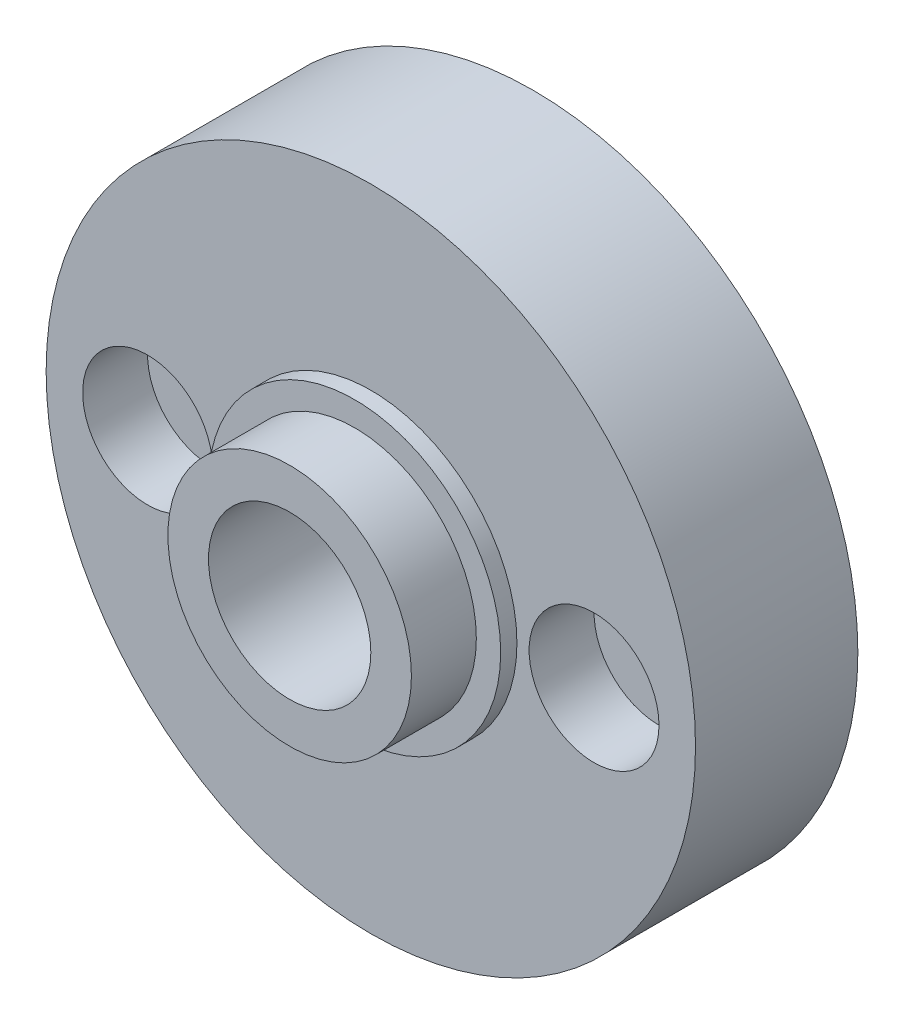
ISO-10303-21;
HEADER;
FILE_DESCRIPTION(('STEP AP214'),'2;1');
FILE_NAME('part.step','',(''),(''),'','','');
FILE_SCHEMA(('AUTOMOTIVE_DESIGN { 1 0 10303 214 1 1 1 1 }'));
ENDSEC;
DATA;
#1=APPLICATION_CONTEXT('core data for automotive mechanical design processes');
#2=APPLICATION_PROTOCOL_DEFINITION('international standard','automotive_design',2000,#1);
#3=PRODUCT_CONTEXT('',#1,'mechanical');
#4=PRODUCT('Part','Part','',(#3));
#5=PRODUCT_RELATED_PRODUCT_CATEGORY('part','',(#4));
#6=PRODUCT_DEFINITION_FORMATION('','',#4);
#7=PRODUCT_DEFINITION_CONTEXT('part definition',#1,'design');
#8=PRODUCT_DEFINITION('design','',#6,#7);
#9=PRODUCT_DEFINITION_SHAPE('','',#8);
#10=(LENGTH_UNIT() NAMED_UNIT(*) SI_UNIT(.MILLI.,.METRE.));
#11=(NAMED_UNIT(*) PLANE_ANGLE_UNIT() SI_UNIT($,.RADIAN.));
#12=(NAMED_UNIT(*) SI_UNIT($,.STERADIAN.) SOLID_ANGLE_UNIT());
#13=UNCERTAINTY_MEASURE_WITH_UNIT(LENGTH_MEASURE(1.E-05),#10,'distance_accuracy_value','');
#14=(GEOMETRIC_REPRESENTATION_CONTEXT(3) GLOBAL_UNCERTAINTY_ASSIGNED_CONTEXT((#13)) GLOBAL_UNIT_ASSIGNED_CONTEXT((#10,
#11,#12)) REPRESENTATION_CONTEXT('',''));
#15=CARTESIAN_POINT('',(0.,0.,0.));
#16=DIRECTION('',(0.,0.,1.));
#17=DIRECTION('',(1.,0.,0.));
#18=AXIS2_PLACEMENT_3D('',#15,#16,#17);
#19=CARTESIAN_POINT('',(-13.75,0.,10.));
#20=DIRECTION('',(0.,0.,-1.));
#21=DIRECTION('',(-1.,0.,0.));
#22=AXIS2_PLACEMENT_3D('',#19,#20,#21);
#23=CYLINDRICAL_SURFACE('',#22,1.65);
#24=CARTESIAN_POINT('',(-13.75,0.,0.));
#25=DIRECTION('',(0.,0.,1.));
#26=DIRECTION('',(1.,0.,0.));
#27=AXIS2_PLACEMENT_3D('',#24,#25,#26);
#28=CIRCLE('',#27,1.65);
#29=CARTESIAN_POINT('',(-12.1,0.,0.));
#30=VERTEX_POINT('',#29);
#31=EDGE_CURVE('E61',#30,#30,#28,.T.);
#32=ORIENTED_EDGE('',*,*,#31,.F.);
#33=EDGE_LOOP('',(#32));
#34=FACE_BOUND('',#33,.T.);
#35=CARTESIAN_POINT('',(-13.75,0.,6.));
#36=DIRECTION('',(0.,0.,1.));
#37=DIRECTION('',(1.,0.,0.));
#38=AXIS2_PLACEMENT_3D('',#35,#36,#37);
#39=CIRCLE('',#38,1.65);
#40=CARTESIAN_POINT('',(-12.1,0.,6.));
#41=VERTEX_POINT('',#40);
#42=EDGE_CURVE('E37',#41,#41,#39,.T.);
#43=ORIENTED_EDGE('',*,*,#42,.T.);
#44=EDGE_LOOP('',(#43));
#45=FACE_BOUND('',#44,.T.);
#46=ADVANCED_FACE('F33',(#34,#45),#23,.F.);
#47=CARTESIAN_POINT('',(13.75,0.,10.));
#48=DIRECTION('',(0.,0.,-1.));
#49=DIRECTION('',(-1.,0.,0.));
#50=AXIS2_PLACEMENT_3D('',#47,#48,#49);
#51=CYLINDRICAL_SURFACE('',#50,1.65);
#52=CARTESIAN_POINT('',(13.75,0.,0.));
#53=DIRECTION('',(0.,0.,1.));
#54=DIRECTION('',(1.,0.,0.));
#55=AXIS2_PLACEMENT_3D('',#52,#53,#54);
#56=CIRCLE('',#55,1.65);
#57=CARTESIAN_POINT('',(15.4,0.,0.));
#58=VERTEX_POINT('',#57);
#59=EDGE_CURVE('E55',#58,#58,#56,.T.);
#60=ORIENTED_EDGE('',*,*,#59,.F.);
#61=EDGE_LOOP('',(#60));
#62=FACE_BOUND('',#61,.T.);
#63=CARTESIAN_POINT('',(13.75,0.,6.));
#64=DIRECTION('',(0.,0.,1.));
#65=DIRECTION('',(1.,0.,0.));
#66=AXIS2_PLACEMENT_3D('',#63,#64,#65);
#67=CIRCLE('',#66,1.65);
#68=CARTESIAN_POINT('',(15.4,0.,6.));
#69=VERTEX_POINT('',#68);
#70=EDGE_CURVE('E68',#69,#69,#67,.T.);
#71=ORIENTED_EDGE('',*,*,#70,.T.);
#72=EDGE_LOOP('',(#71));
#73=FACE_BOUND('',#72,.T.);
#74=ADVANCED_FACE('F112',(#62,#73),#51,.F.);
#75=CARTESIAN_POINT('',(0.,0.,10.));
#76=DIRECTION('',(0.,0.,1.));
#77=DIRECTION('',(1.,0.,0.));
#78=AXIS2_PLACEMENT_3D('',#75,#76,#77);
#79=PLANE('',#78);
#80=CARTESIAN_POINT('',(-13.75,0.,10.));
#81=DIRECTION('',(0.,0.,1.));
#82=DIRECTION('',(1.,0.,0.));
#83=AXIS2_PLACEMENT_3D('',#80,#81,#82);
#84=CIRCLE('',#83,4.);
#85=CARTESIAN_POINT('',(-9.75,0.,10.));
#86=VERTEX_POINT('',#85);
#87=EDGE_CURVE('E76',#86,#86,#84,.T.);
#88=ORIENTED_EDGE('',*,*,#87,.F.);
#89=EDGE_LOOP('',(#88));
#90=FACE_BOUND('',#89,.T.);
#91=CARTESIAN_POINT('',(13.75,0.,10.));
#92=DIRECTION('',(0.,0.,1.));
#93=DIRECTION('',(1.,0.,0.));
#94=AXIS2_PLACEMENT_3D('',#91,#92,#93);
#95=CIRCLE('',#94,4.);
#96=CARTESIAN_POINT('',(17.75,0.,10.));
#97=VERTEX_POINT('',#96);
#98=EDGE_CURVE('E86',#97,#97,#95,.T.);
#99=ORIENTED_EDGE('',*,*,#98,.F.);
#100=EDGE_LOOP('',(#99));
#101=FACE_BOUND('',#100,.T.);
#102=CARTESIAN_POINT('',(0.,0.,10.));
#103=DIRECTION('',(0.,0.,1.));
#104=DIRECTION('',(1.,0.,0.));
#105=AXIS2_PLACEMENT_3D('',#102,#103,#104);
#106=CIRCLE('',#105,20.);
#107=CARTESIAN_POINT('',(20.,0.,10.));
#108=VERTEX_POINT('',#107);
#109=EDGE_CURVE('E41',#108,#108,#106,.T.);
#110=ORIENTED_EDGE('',*,*,#109,.T.);
#111=EDGE_LOOP('',(#110));
#112=FACE_BOUND('',#111,.T.);
#113=CARTESIAN_POINT('',(0.,0.,10.));
#114=DIRECTION('',(0.,0.,1.));
#115=DIRECTION('',(1.,0.,0.));
#116=AXIS2_PLACEMENT_3D('',#113,#114,#115);
#117=CIRCLE('',#116,9.);
#118=CARTESIAN_POINT('',(9.,0.,10.));
#119=VERTEX_POINT('',#118);
#120=EDGE_CURVE('E56',#119,#119,#117,.T.);
#121=ORIENTED_EDGE('',*,*,#120,.F.);
#122=EDGE_LOOP('',(#121));
#123=FACE_BOUND('',#122,.T.);
#124=ADVANCED_FACE('F118',(#90,#101,#112,#123),#79,.T.);
#125=CARTESIAN_POINT('',(0.,0.,0.));
#126=DIRECTION('',(0.,0.,1.));
#127=DIRECTION('',(1.,0.,0.));
#128=AXIS2_PLACEMENT_3D('',#125,#126,#127);
#129=PLANE('',#128);
#130=CARTESIAN_POINT('',(0.,0.,0.));
#131=DIRECTION('',(0.,0.,1.));
#132=DIRECTION('',(1.,0.,0.));
#133=AXIS2_PLACEMENT_3D('',#130,#131,#132);
#134=CIRCLE('',#133,20.);
#135=CARTESIAN_POINT('',(20.,0.,0.));
#136=VERTEX_POINT('',#135);
#137=EDGE_CURVE('E46',#136,#136,#134,.T.);
#138=ORIENTED_EDGE('',*,*,#137,.F.);
#139=EDGE_LOOP('',(#138));
#140=FACE_BOUND('',#139,.T.);
#141=CARTESIAN_POINT('',(0.,0.,0.));
#142=DIRECTION('',(0.,0.,1.));
#143=DIRECTION('',(1.,0.,0.));
#144=AXIS2_PLACEMENT_3D('',#141,#142,#143);
#145=CIRCLE('',#144,5.);
#146=CARTESIAN_POINT('',(5.,0.,0.));
#147=VERTEX_POINT('',#146);
#148=EDGE_CURVE('E64',#147,#147,#145,.T.);
#149=ORIENTED_EDGE('',*,*,#148,.T.);
#150=EDGE_LOOP('',(#149));
#151=FACE_BOUND('',#150,.T.);
#152=ORIENTED_EDGE('',*,*,#31,.T.);
#153=EDGE_LOOP('',(#152));
#154=FACE_BOUND('',#153,.T.);
#155=ORIENTED_EDGE('',*,*,#59,.T.);
#156=EDGE_LOOP('',(#155));
#157=FACE_BOUND('',#156,.T.);
#158=ADVANCED_FACE('F131',(#140,#151,#154,#157),#129,.F.);
#159=CARTESIAN_POINT('',(0.,0.,10.));
#160=DIRECTION('',(0.,0.,-1.));
#161=DIRECTION('',(-1.,0.,0.));
#162=AXIS2_PLACEMENT_3D('',#159,#160,#161);
#163=CYLINDRICAL_SURFACE('',#162,20.);
#164=ORIENTED_EDGE('',*,*,#109,.F.);
#165=EDGE_LOOP('',(#164));
#166=FACE_BOUND('',#165,.T.);
#167=ORIENTED_EDGE('',*,*,#137,.T.);
#168=EDGE_LOOP('',(#167));
#169=FACE_BOUND('',#168,.T.);
#170=ADVANCED_FACE('F35',(#166,#169),#163,.T.);
#171=CARTESIAN_POINT('',(0.,0.,10.));
#172=DIRECTION('',(0.,0.,-1.));
#173=DIRECTION('',(-1.,0.,0.));
#174=AXIS2_PLACEMENT_3D('',#171,#172,#173);
#175=CYLINDRICAL_SURFACE('',#174,5.);
#176=ORIENTED_EDGE('',*,*,#148,.F.);
#177=EDGE_LOOP('',(#176));
#178=FACE_BOUND('',#177,.T.);
#179=CARTESIAN_POINT('',(0.,0.,15.));
#180=DIRECTION('',(0.,0.,1.));
#181=DIRECTION('',(1.,0.,0.));
#182=AXIS2_PLACEMENT_3D('',#179,#180,#181);
#183=CIRCLE('',#182,5.);
#184=CARTESIAN_POINT('',(5.,0.,15.));
#185=VERTEX_POINT('',#184);
#186=EDGE_CURVE('E74',#185,#185,#183,.T.);
#187=ORIENTED_EDGE('',*,*,#186,.T.);
#188=EDGE_LOOP('',(#187));
#189=FACE_BOUND('',#188,.T.);
#190=ADVANCED_FACE('F125',(#178,#189),#175,.F.);
#191=CARTESIAN_POINT('',(0.,0.,11.));
#192=DIRECTION('',(0.,0.,1.));
#193=DIRECTION('',(1.,0.,0.));
#194=AXIS2_PLACEMENT_3D('',#191,#192,#193);
#195=PLANE('',#194);
#196=CARTESIAN_POINT('',(0.,0.,11.));
#197=DIRECTION('',(0.,0.,1.));
#198=DIRECTION('',(1.,0.,0.));
#199=AXIS2_PLACEMENT_3D('',#196,#197,#198);
#200=CIRCLE('',#199,7.5);
#201=CARTESIAN_POINT('',(7.5,0.,11.));
#202=VERTEX_POINT('',#201);
#203=EDGE_CURVE('E10',#202,#202,#200,.T.);
#204=ORIENTED_EDGE('',*,*,#203,.F.);
#205=EDGE_LOOP('',(#204));
#206=FACE_BOUND('',#205,.T.);
#207=CARTESIAN_POINT('',(0.,0.,11.));
#208=DIRECTION('',(0.,0.,1.));
#209=DIRECTION('',(1.,0.,0.));
#210=AXIS2_PLACEMENT_3D('',#207,#208,#209);
#211=CIRCLE('',#210,9.);
#212=CARTESIAN_POINT('',(9.,0.,11.));
#213=VERTEX_POINT('',#212);
#214=EDGE_CURVE('E52',#213,#213,#211,.T.);
#215=ORIENTED_EDGE('',*,*,#214,.T.);
#216=EDGE_LOOP('',(#215));
#217=FACE_BOUND('',#216,.T.);
#218=ADVANCED_FACE('F128',(#206,#217),#195,.T.);
#219=CARTESIAN_POINT('',(0.,0.,11.));
#220=DIRECTION('',(0.,0.,-1.));
#221=DIRECTION('',(-1.,0.,0.));
#222=AXIS2_PLACEMENT_3D('',#219,#220,#221);
#223=CYLINDRICAL_SURFACE('',#222,9.);
#224=ORIENTED_EDGE('',*,*,#214,.F.);
#225=EDGE_LOOP('',(#224));
#226=FACE_BOUND('',#225,.T.);
#227=ORIENTED_EDGE('',*,*,#120,.T.);
#228=EDGE_LOOP('',(#227));
#229=FACE_BOUND('',#228,.T.);
#230=ADVANCED_FACE('F108',(#226,#229),#223,.T.);
#231=CARTESIAN_POINT('',(0.,0.,15.));
#232=DIRECTION('',(0.,0.,1.));
#233=DIRECTION('',(1.,0.,0.));
#234=AXIS2_PLACEMENT_3D('',#231,#232,#233);
#235=PLANE('',#234);
#236=CARTESIAN_POINT('',(0.,0.,15.));
#237=DIRECTION('',(0.,0.,1.));
#238=DIRECTION('',(1.,0.,0.));
#239=AXIS2_PLACEMENT_3D('',#236,#237,#238);
#240=CIRCLE('',#239,7.5);
#241=CARTESIAN_POINT('',(7.5,0.,15.));
#242=VERTEX_POINT('',#241);
#243=EDGE_CURVE('E50',#242,#242,#240,.T.);
#244=ORIENTED_EDGE('',*,*,#243,.T.);
#245=EDGE_LOOP('',(#244));
#246=FACE_BOUND('',#245,.T.);
#247=ORIENTED_EDGE('',*,*,#186,.F.);
#248=EDGE_LOOP('',(#247));
#249=FACE_BOUND('',#248,.T.);
#250=ADVANCED_FACE('F94',(#246,#249),#235,.T.);
#251=CARTESIAN_POINT('',(0.,0.,15.));
#252=DIRECTION('',(0.,0.,-1.));
#253=DIRECTION('',(-1.,0.,0.));
#254=AXIS2_PLACEMENT_3D('',#251,#252,#253);
#255=CYLINDRICAL_SURFACE('',#254,7.5);
#256=ORIENTED_EDGE('',*,*,#243,.F.);
#257=EDGE_LOOP('',(#256));
#258=FACE_BOUND('',#257,.T.);
#259=ORIENTED_EDGE('',*,*,#203,.T.);
#260=EDGE_LOOP('',(#259));
#261=FACE_BOUND('',#260,.T.);
#262=ADVANCED_FACE('F97',(#258,#261),#255,.T.);
#263=CARTESIAN_POINT('',(13.75,0.,6.));
#264=DIRECTION('',(0.,0.,1.));
#265=DIRECTION('',(1.,0.,0.));
#266=AXIS2_PLACEMENT_3D('',#263,#264,#265);
#267=CYLINDRICAL_SURFACE('',#266,4.);
#268=CARTESIAN_POINT('',(13.75,0.,6.));
#269=DIRECTION('',(0.,0.,1.));
#270=DIRECTION('',(1.,0.,0.));
#271=AXIS2_PLACEMENT_3D('',#268,#269,#270);
#272=CIRCLE('',#271,4.);
#273=CARTESIAN_POINT('',(17.75,0.,6.));
#274=VERTEX_POINT('',#273);
#275=EDGE_CURVE('E81',#274,#274,#272,.T.);
#276=ORIENTED_EDGE('',*,*,#275,.F.);
#277=EDGE_LOOP('',(#276));
#278=FACE_BOUND('',#277,.T.);
#279=ORIENTED_EDGE('',*,*,#98,.T.);
#280=EDGE_LOOP('',(#279));
#281=FACE_BOUND('',#280,.T.);
#282=ADVANCED_FACE('F99',(#278,#281),#267,.F.);
#283=CARTESIAN_POINT('',(13.75,0.,6.));
#284=DIRECTION('',(0.,0.,1.));
#285=DIRECTION('',(1.,0.,0.));
#286=AXIS2_PLACEMENT_3D('',#283,#284,#285);
#287=PLANE('',#286);
#288=ORIENTED_EDGE('',*,*,#70,.F.);
#289=EDGE_LOOP('',(#288));
#290=FACE_BOUND('',#289,.T.);
#291=ORIENTED_EDGE('',*,*,#275,.T.);
#292=EDGE_LOOP('',(#291));
#293=FACE_BOUND('',#292,.T.);
#294=ADVANCED_FACE('F105',(#290,#293),#287,.T.);
#295=CARTESIAN_POINT('',(-13.75,0.,6.));
#296=DIRECTION('',(0.,0.,1.));
#297=DIRECTION('',(1.,0.,0.));
#298=AXIS2_PLACEMENT_3D('',#295,#296,#297);
#299=CYLINDRICAL_SURFACE('',#298,4.);
#300=CARTESIAN_POINT('',(-13.75,0.,6.));
#301=DIRECTION('',(0.,0.,1.));
#302=DIRECTION('',(1.,0.,0.));
#303=AXIS2_PLACEMENT_3D('',#300,#301,#302);
#304=CIRCLE('',#303,4.);
#305=CARTESIAN_POINT('',(-9.75,0.,6.));
#306=VERTEX_POINT('',#305);
#307=EDGE_CURVE('E70',#306,#306,#304,.T.);
#308=ORIENTED_EDGE('',*,*,#307,.F.);
#309=EDGE_LOOP('',(#308));
#310=FACE_BOUND('',#309,.T.);
#311=ORIENTED_EDGE('',*,*,#87,.T.);
#312=EDGE_LOOP('',(#311));
#313=FACE_BOUND('',#312,.T.);
#314=ADVANCED_FACE('F212',(#310,#313),#299,.F.);
#315=CARTESIAN_POINT('',(-13.75,0.,6.));
#316=DIRECTION('',(0.,0.,1.));
#317=DIRECTION('',(1.,0.,0.));
#318=AXIS2_PLACEMENT_3D('',#315,#316,#317);
#319=PLANE('',#318);
#320=ORIENTED_EDGE('',*,*,#42,.F.);
#321=EDGE_LOOP('',(#320));
#322=FACE_BOUND('',#321,.T.);
#323=ORIENTED_EDGE('',*,*,#307,.T.);
#324=EDGE_LOOP('',(#323));
#325=FACE_BOUND('',#324,.T.);
#326=ADVANCED_FACE('F222',(#322,#325),#319,.T.);
#327=CLOSED_SHELL('',(#46,#74,#124,#158,#170,#190,#218,#230,#250,#262,#282,#294,#314,#326));
#328=MANIFOLD_SOLID_BREP('B2',#327);
#329=ADVANCED_BREP_SHAPE_REPRESENTATION('',(#18,#328),#14);
#330=SHAPE_DEFINITION_REPRESENTATION(#9,#329);
ENDSEC;
END-ISO-10303-21;
